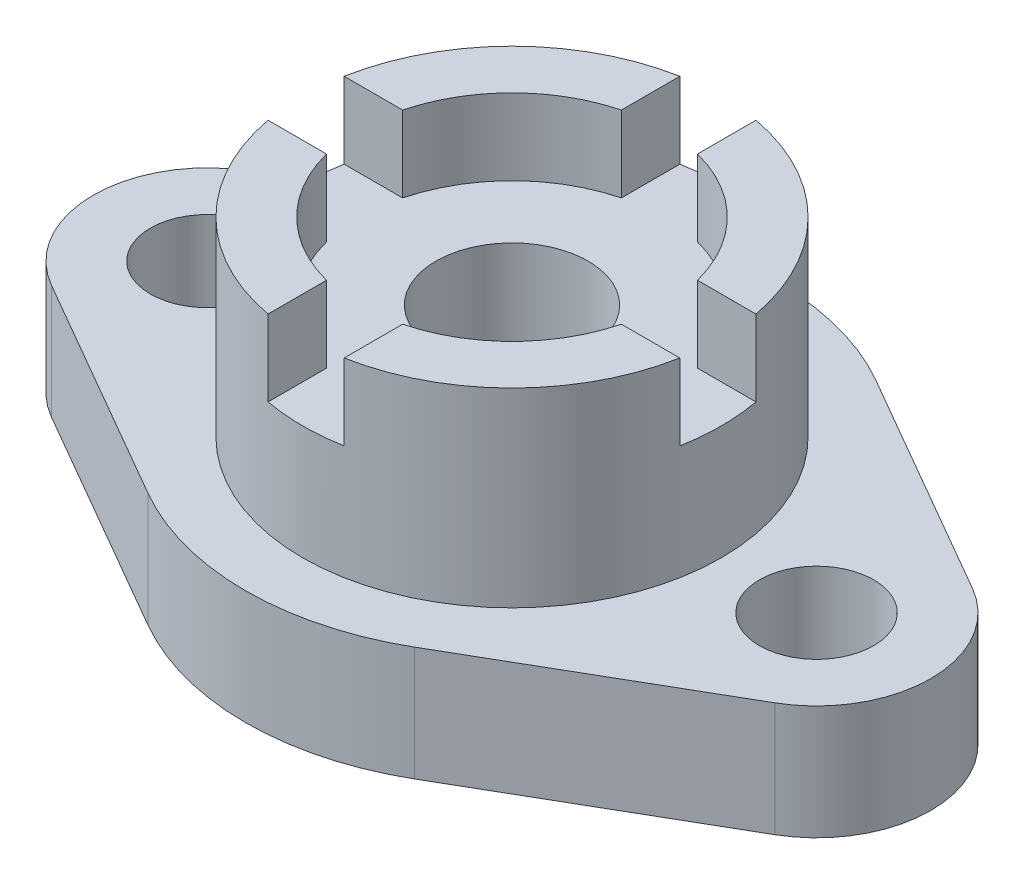
ISO-10303-21;
HEADER;
FILE_DESCRIPTION(('STEP AP214'),'2;1');
FILE_NAME('part.step','',(''),(''),'','','');
FILE_SCHEMA(('AUTOMOTIVE_DESIGN { 1 0 10303 214 1 1 1 1 }'));
ENDSEC;
DATA;
#1=APPLICATION_CONTEXT('core data for automotive mechanical design processes');
#2=APPLICATION_PROTOCOL_DEFINITION('international standard','automotive_design',2000,#1);
#3=PRODUCT_CONTEXT('',#1,'mechanical');
#4=PRODUCT('Part','Part','',(#3));
#5=PRODUCT_RELATED_PRODUCT_CATEGORY('part','',(#4));
#6=PRODUCT_DEFINITION_FORMATION('','',#4);
#7=PRODUCT_DEFINITION_CONTEXT('part definition',#1,'design');
#8=PRODUCT_DEFINITION('design','',#6,#7);
#9=PRODUCT_DEFINITION_SHAPE('','',#8);
#10=(LENGTH_UNIT() NAMED_UNIT(*) SI_UNIT(.MILLI.,.METRE.));
#11=(NAMED_UNIT(*) PLANE_ANGLE_UNIT() SI_UNIT($,.RADIAN.));
#12=(NAMED_UNIT(*) SI_UNIT($,.STERADIAN.) SOLID_ANGLE_UNIT());
#13=UNCERTAINTY_MEASURE_WITH_UNIT(LENGTH_MEASURE(1.E-05),#10,'distance_accuracy_value','');
#14=(GEOMETRIC_REPRESENTATION_CONTEXT(3) GLOBAL_UNCERTAINTY_ASSIGNED_CONTEXT((#13)) GLOBAL_UNIT_ASSIGNED_CONTEXT((#10,
#11,#12)) REPRESENTATION_CONTEXT('',''));
#15=CARTESIAN_POINT('',(0.,0.,0.));
#16=DIRECTION('',(0.,0.,1.));
#17=DIRECTION('',(1.,0.,0.));
#18=AXIS2_PLACEMENT_3D('',#15,#16,#17);
#19=CARTESIAN_POINT('',(0.,2.,0.));
#20=DIRECTION('',(0.,1.,0.));
#21=DIRECTION('',(0.,0.,1.));
#22=AXIS2_PLACEMENT_3D('',#19,#20,#21);
#23=PLANE('',#22);
#24=DIRECTION('',(0.,0.,-1.));
#25=VECTOR('',#24,1.);
#26=CARTESIAN_POINT('',(0.25,2.,-1.352081728299));
#27=LINE('',#26,#25);
#28=CARTESIAN_POINT('',(0.25,2.,-0.968245836551854));
#29=VERTEX_POINT('',#28);
#30=CARTESIAN_POINT('',(0.25,2.,-1.352081728299));
#31=VERTEX_POINT('',#30);
#32=EDGE_CURVE('E266',#29,#31,#27,.T.);
#33=ORIENTED_EDGE('',*,*,#32,.F.);
#34=CARTESIAN_POINT('',(0.,2.,0.));
#35=DIRECTION('',(0.,1.,0.));
#36=DIRECTION('',(0.,0.,1.));
#37=AXIS2_PLACEMENT_3D('',#34,#35,#36);
#38=CIRCLE('',#37,1.);
#39=CARTESIAN_POINT('',(0.968245836551854,2.,-0.25));
#40=VERTEX_POINT('',#39);
#41=EDGE_CURVE('E270',#40,#29,#38,.T.);
#42=ORIENTED_EDGE('',*,*,#41,.F.);
#43=DIRECTION('',(-1.,0.,0.));
#44=VECTOR('',#43,1.);
#45=CARTESIAN_POINT('',(0.968245836551854,2.,-0.25));
#46=LINE('',#45,#44);
#47=CARTESIAN_POINT('',(1.352081728299,2.,-0.25));
#48=VERTEX_POINT('',#47);
#49=EDGE_CURVE('E273',#48,#40,#46,.T.);
#50=ORIENTED_EDGE('',*,*,#49,.F.);
#51=CARTESIAN_POINT('',(0.,2.,0.));
#52=DIRECTION('',(0.,1.,0.));
#53=DIRECTION('',(0.,0.,1.));
#54=AXIS2_PLACEMENT_3D('',#51,#52,#53);
#55=CIRCLE('',#54,1.375);
#56=EDGE_CURVE('E216',#48,#31,#55,.T.);
#57=ORIENTED_EDGE('',*,*,#56,.T.);
#58=EDGE_LOOP('',(#33,#42,#50,#57));
#59=FACE_BOUND('',#58,.T.);
#60=ADVANCED_FACE('F37',(#59),#23,.T.);
#61=DIRECTION('',(1.,0.,0.));
#62=VECTOR('',#61,1.);
#63=CARTESIAN_POINT('',(1.352081728299,2.,0.25));
#64=LINE('',#63,#62);
#65=CARTESIAN_POINT('',(0.968245836551854,2.,0.25));
#66=VERTEX_POINT('',#65);
#67=CARTESIAN_POINT('',(1.352081728299,2.,0.25));
#68=VERTEX_POINT('',#67);
#69=EDGE_CURVE('E276',#66,#68,#64,.T.);
#70=ORIENTED_EDGE('',*,*,#69,.F.);
#71=CARTESIAN_POINT('',(0.,2.,0.));
#72=DIRECTION('',(0.,1.,0.));
#73=DIRECTION('',(0.,0.,1.));
#74=AXIS2_PLACEMENT_3D('',#71,#72,#73);
#75=CIRCLE('',#74,1.);
#76=CARTESIAN_POINT('',(0.25,2.,0.968245836551854));
#77=VERTEX_POINT('',#76);
#78=EDGE_CURVE('E279',#77,#66,#75,.T.);
#79=ORIENTED_EDGE('',*,*,#78,.F.);
#80=DIRECTION('',(0.,0.,-1.));
#81=VECTOR('',#80,1.);
#82=CARTESIAN_POINT('',(0.25,2.,1.352081728299));
#83=LINE('',#82,#81);
#84=CARTESIAN_POINT('',(0.25,2.,1.352081728299));
#85=VERTEX_POINT('',#84);
#86=EDGE_CURVE('E282',#85,#77,#83,.T.);
#87=ORIENTED_EDGE('',*,*,#86,.F.);
#88=EDGE_CURVE('E201',#85,#68,#55,.T.);
#89=ORIENTED_EDGE('',*,*,#88,.T.);
#90=EDGE_LOOP('',(#70,#79,#87,#89));
#91=FACE_BOUND('',#90,.T.);
#92=ADVANCED_FACE('F456',(#91),#23,.T.);
#93=DIRECTION('',(0.,0.,1.));
#94=VECTOR('',#93,1.);
#95=CARTESIAN_POINT('',(-0.25,2.,1.352081728299));
#96=LINE('',#95,#94);
#97=CARTESIAN_POINT('',(-0.25,2.,0.968245836551854));
#98=VERTEX_POINT('',#97);
#99=CARTESIAN_POINT('',(-0.25,2.,1.352081728299));
#100=VERTEX_POINT('',#99);
#101=EDGE_CURVE('E285',#98,#100,#96,.T.);
#102=ORIENTED_EDGE('',*,*,#101,.F.);
#103=CARTESIAN_POINT('',(0.,2.,0.));
#104=DIRECTION('',(0.,1.,0.));
#105=DIRECTION('',(0.,0.,1.));
#106=AXIS2_PLACEMENT_3D('',#103,#104,#105);
#107=CIRCLE('',#106,1.);
#108=CARTESIAN_POINT('',(-0.968245836551854,2.,0.25));
#109=VERTEX_POINT('',#108);
#110=EDGE_CURVE('E288',#109,#98,#107,.T.);
#111=ORIENTED_EDGE('',*,*,#110,.F.);
#112=DIRECTION('',(1.,0.,0.));
#113=VECTOR('',#112,1.);
#114=CARTESIAN_POINT('',(-1.352081728299,2.,0.25));
#115=LINE('',#114,#113);
#116=CARTESIAN_POINT('',(-1.352081728299,2.,0.25));
#117=VERTEX_POINT('',#116);
#118=EDGE_CURVE('E291',#117,#109,#115,.T.);
#119=ORIENTED_EDGE('',*,*,#118,.F.);
#120=EDGE_CURVE('E212',#117,#100,#55,.T.);
#121=ORIENTED_EDGE('',*,*,#120,.T.);
#122=EDGE_LOOP('',(#102,#111,#119,#121));
#123=FACE_BOUND('',#122,.T.);
#124=ADVANCED_FACE('F374',(#123),#23,.T.);
#125=CARTESIAN_POINT('',(0.,0.,0.));
#126=DIRECTION('',(0.,1.,0.));
#127=DIRECTION('',(0.,0.,1.));
#128=AXIS2_PLACEMENT_3D('',#125,#126,#127);
#129=CYLINDRICAL_SURFACE('',#128,0.5);
#130=CARTESIAN_POINT('',(0.,0.,0.));
#131=DIRECTION('',(0.,1.,0.));
#132=DIRECTION('',(0.,0.,1.));
#133=AXIS2_PLACEMENT_3D('',#130,#131,#132);
#134=CIRCLE('',#133,0.5);
#135=CARTESIAN_POINT('',(0.,0.,0.5));
#136=VERTEX_POINT('',#135);
#137=EDGE_CURVE('E213',#136,#136,#134,.T.);
#138=ORIENTED_EDGE('',*,*,#137,.F.);
#139=EDGE_LOOP('',(#138));
#140=FACE_BOUND('',#139,.T.);
#141=CARTESIAN_POINT('',(0.,1.5,0.));
#142=DIRECTION('',(0.,1.,0.));
#143=DIRECTION('',(0.,0.,1.));
#144=AXIS2_PLACEMENT_3D('',#141,#142,#143);
#145=CIRCLE('',#144,0.5);
#146=CARTESIAN_POINT('',(0.,1.5,0.5));
#147=VERTEX_POINT('',#146);
#148=EDGE_CURVE('E41',#147,#147,#145,.F.);
#149=ORIENTED_EDGE('',*,*,#148,.F.);
#150=EDGE_LOOP('',(#149));
#151=FACE_BOUND('',#150,.T.);
#152=ADVANCED_FACE('F458',(#140,#151),#129,.F.);
#153=CARTESIAN_POINT('',(-2.,0.75,0.));
#154=DIRECTION('',(0.,-1.,0.));
#155=DIRECTION('',(0.,0.,-1.));
#156=AXIS2_PLACEMENT_3D('',#153,#154,#155);
#157=CYLINDRICAL_SURFACE('',#156,0.749999999999999);
#158=CARTESIAN_POINT('',(-2.,0.,0.));
#159=DIRECTION('',(0.,1.,0.));
#160=DIRECTION('',(0.,0.,1.));
#161=AXIS2_PLACEMENT_3D('',#158,#159,#160);
#162=CIRCLE('',#161,0.749999999999999);
#163=CARTESIAN_POINT('',(-2.375,0.,-0.649519052838329));
#164=VERTEX_POINT('',#163);
#165=CARTESIAN_POINT('',(-2.37499999999998,0.,0.649519052838339));
#166=VERTEX_POINT('',#165);
#167=EDGE_CURVE('E147',#164,#166,#162,.T.);
#168=ORIENTED_EDGE('',*,*,#167,.T.);
#169=DIRECTION('',(0.,-1.,0.));
#170=VECTOR('',#169,1.);
#171=CARTESIAN_POINT('',(-2.37499999999998,0.75,0.649519052838339));
#172=LINE('',#171,#170);
#173=CARTESIAN_POINT('',(-2.37499999999998,0.75,0.649519052838339));
#174=VERTEX_POINT('',#173);
#175=EDGE_CURVE('E11',#174,#166,#172,.T.);
#176=ORIENTED_EDGE('',*,*,#175,.F.);
#177=CARTESIAN_POINT('',(-2.,0.75,0.));
#178=DIRECTION('',(0.,1.,0.));
#179=DIRECTION('',(0.,0.,1.));
#180=AXIS2_PLACEMENT_3D('',#177,#178,#179);
#181=CIRCLE('',#180,0.749999999999999);
#182=CARTESIAN_POINT('',(-2.375,0.75,-0.649519052838329));
#183=VERTEX_POINT('',#182);
#184=EDGE_CURVE('E163',#183,#174,#181,.T.);
#185=ORIENTED_EDGE('',*,*,#184,.F.);
#186=DIRECTION('',(0.,-1.,0.));
#187=VECTOR('',#186,1.);
#188=CARTESIAN_POINT('',(-2.375,0.75,-0.649519052838329));
#189=LINE('',#188,#187);
#190=EDGE_CURVE('E143',#183,#164,#189,.T.);
#191=ORIENTED_EDGE('',*,*,#190,.T.);
#192=EDGE_LOOP('',(#168,#176,#185,#191));
#193=FACE_BOUND('',#192,.T.);
#194=ADVANCED_FACE('F39',(#193),#157,.T.);
#195=CARTESIAN_POINT('',(-2.37499999999998,0.75,0.649519052838339));
#196=DIRECTION('',(0.500000000000001,0.,-0.866025403784438));
#197=DIRECTION('',(-0.866025403784438,0.,-0.500000000000001));
#198=AXIS2_PLACEMENT_3D('',#195,#196,#197);
#199=PLANE('',#198);
#200=DIRECTION('',(0.866025403784438,0.,0.500000000000001));
#201=VECTOR('',#200,1.);
#202=CARTESIAN_POINT('',(-2.37499999999998,0.,0.649519052838339));
#203=LINE('',#202,#201);
#204=CARTESIAN_POINT('',(-0.875000000000001,0.,1.51554445662277));
#205=VERTEX_POINT('',#204);
#206=EDGE_CURVE('E150',#166,#205,#203,.T.);
#207=ORIENTED_EDGE('',*,*,#206,.T.);
#208=DIRECTION('',(0.,-1.,0.));
#209=VECTOR('',#208,1.);
#210=CARTESIAN_POINT('',(-0.875000000000001,0.75,1.51554445662277));
#211=LINE('',#210,#209);
#212=CARTESIAN_POINT('',(-0.875000000000001,0.75,1.51554445662277));
#213=VERTEX_POINT('',#212);
#214=EDGE_CURVE('E46',#213,#205,#211,.T.);
#215=ORIENTED_EDGE('',*,*,#214,.F.);
#216=DIRECTION('',(0.866025403784438,0.,0.500000000000001));
#217=VECTOR('',#216,1.);
#218=CARTESIAN_POINT('',(-2.37499999999998,0.75,0.649519052838339));
#219=LINE('',#218,#217);
#220=EDGE_CURVE('E103',#174,#213,#219,.T.);
#221=ORIENTED_EDGE('',*,*,#220,.F.);
#222=ORIENTED_EDGE('',*,*,#175,.T.);
#223=EDGE_LOOP('',(#207,#215,#221,#222));
#224=FACE_BOUND('',#223,.T.);
#225=ADVANCED_FACE('F708',(#224),#199,.F.);
#226=CARTESIAN_POINT('',(0.,0.75,0.));
#227=DIRECTION('',(0.,-1.,0.));
#228=DIRECTION('',(0.,0.,-1.));
#229=AXIS2_PLACEMENT_3D('',#226,#227,#228);
#230=CYLINDRICAL_SURFACE('',#229,1.75);
#231=CARTESIAN_POINT('',(0.,0.,0.));
#232=DIRECTION('',(0.,1.,0.));
#233=DIRECTION('',(0.,0.,1.));
#234=AXIS2_PLACEMENT_3D('',#231,#232,#233);
#235=CIRCLE('',#234,1.75);
#236=CARTESIAN_POINT('',(0.875000000000001,0.,1.51554445662277));
#237=VERTEX_POINT('',#236);
#238=EDGE_CURVE('E153',#205,#237,#235,.T.);
#239=ORIENTED_EDGE('',*,*,#238,.T.);
#240=DIRECTION('',(0.,-1.,0.));
#241=VECTOR('',#240,1.);
#242=CARTESIAN_POINT('',(0.875000000000001,0.75,1.51554445662277));
#243=LINE('',#242,#241);
#244=CARTESIAN_POINT('',(0.875000000000001,0.75,1.51554445662277));
#245=VERTEX_POINT('',#244);
#246=EDGE_CURVE('E170',#245,#237,#243,.T.);
#247=ORIENTED_EDGE('',*,*,#246,.F.);
#248=CARTESIAN_POINT('',(0.,0.75,0.));
#249=DIRECTION('',(0.,1.,0.));
#250=DIRECTION('',(0.,0.,1.));
#251=AXIS2_PLACEMENT_3D('',#248,#249,#250);
#252=CIRCLE('',#251,1.75);
#253=EDGE_CURVE('E179',#213,#245,#252,.T.);
#254=ORIENTED_EDGE('',*,*,#253,.F.);
#255=ORIENTED_EDGE('',*,*,#214,.T.);
#256=EDGE_LOOP('',(#239,#247,#254,#255));
#257=FACE_BOUND('',#256,.T.);
#258=ADVANCED_FACE('F177',(#257),#230,.T.);
#259=CARTESIAN_POINT('',(2.37499999999998,0.75,0.649519052838338));
#260=DIRECTION('',(-0.5,0.,-0.866025403784439));
#261=DIRECTION('',(-0.866025403784439,0.,0.5));
#262=AXIS2_PLACEMENT_3D('',#259,#260,#261);
#263=PLANE('',#262);
#264=DIRECTION('',(0.866025403784439,0.,-0.5));
#265=VECTOR('',#264,1.);
#266=CARTESIAN_POINT('',(2.37499999999998,0.,0.649519052838338));
#267=LINE('',#266,#265);
#268=CARTESIAN_POINT('',(2.37499999999998,0.,0.649519052838338));
#269=VERTEX_POINT('',#268);
#270=EDGE_CURVE('E155',#237,#269,#267,.T.);
#271=ORIENTED_EDGE('',*,*,#270,.T.);
#272=DIRECTION('',(0.,-1.,0.));
#273=VECTOR('',#272,1.);
#274=CARTESIAN_POINT('',(2.37499999999998,0.75,0.649519052838338));
#275=LINE('',#274,#273);
#276=CARTESIAN_POINT('',(2.37499999999998,0.75,0.649519052838338));
#277=VERTEX_POINT('',#276);
#278=EDGE_CURVE('E167',#277,#269,#275,.T.);
#279=ORIENTED_EDGE('',*,*,#278,.F.);
#280=DIRECTION('',(0.866025403784439,0.,-0.5));
#281=VECTOR('',#280,1.);
#282=CARTESIAN_POINT('',(2.37499999999998,0.75,0.649519052838338));
#283=LINE('',#282,#281);
#284=EDGE_CURVE('E191',#245,#277,#283,.T.);
#285=ORIENTED_EDGE('',*,*,#284,.F.);
#286=ORIENTED_EDGE('',*,*,#246,.T.);
#287=EDGE_LOOP('',(#271,#279,#285,#286));
#288=FACE_BOUND('',#287,.T.);
#289=ADVANCED_FACE('F187',(#288),#263,.F.);
#290=CARTESIAN_POINT('',(2.,0.75,0.));
#291=DIRECTION('',(0.,-1.,0.));
#292=DIRECTION('',(0.,0.,-1.));
#293=AXIS2_PLACEMENT_3D('',#290,#291,#292);
#294=CYLINDRICAL_SURFACE('',#293,0.749999999999999);
#295=CARTESIAN_POINT('',(2.,0.,0.));
#296=DIRECTION('',(0.,1.,0.));
#297=DIRECTION('',(0.,0.,1.));
#298=AXIS2_PLACEMENT_3D('',#295,#296,#297);
#299=CIRCLE('',#298,0.749999999999999);
#300=CARTESIAN_POINT('',(2.375,0.,-0.649519052838328));
#301=VERTEX_POINT('',#300);
#302=EDGE_CURVE('E157',#269,#301,#299,.T.);
#303=ORIENTED_EDGE('',*,*,#302,.T.);
#304=DIRECTION('',(0.,-1.,0.));
#305=VECTOR('',#304,1.);
#306=CARTESIAN_POINT('',(2.375,0.75,-0.649519052838328));
#307=LINE('',#306,#305);
#308=CARTESIAN_POINT('',(2.375,0.75,-0.649519052838328));
#309=VERTEX_POINT('',#308);
#310=EDGE_CURVE('E138',#309,#301,#307,.T.);
#311=ORIENTED_EDGE('',*,*,#310,.F.);
#312=CARTESIAN_POINT('',(2.,0.75,0.));
#313=DIRECTION('',(0.,1.,0.));
#314=DIRECTION('',(0.,0.,1.));
#315=AXIS2_PLACEMENT_3D('',#312,#313,#314);
#316=CIRCLE('',#315,0.749999999999999);
#317=EDGE_CURVE('E126',#277,#309,#316,.T.);
#318=ORIENTED_EDGE('',*,*,#317,.F.);
#319=ORIENTED_EDGE('',*,*,#278,.T.);
#320=EDGE_LOOP('',(#303,#311,#318,#319));
#321=FACE_BOUND('',#320,.T.);
#322=ADVANCED_FACE('F190',(#321),#294,.T.);
#323=CARTESIAN_POINT('',(2.375,0.75,-0.64951905283833));
#324=DIRECTION('',(-0.5,0.,0.866025403784438));
#325=DIRECTION('',(0.866025403784439,0.,0.5));
#326=AXIS2_PLACEMENT_3D('',#323,#324,#325);
#327=PLANE('',#326);
#328=DIRECTION('',(-0.866025403784439,0.,-0.5));
#329=VECTOR('',#328,1.);
#330=CARTESIAN_POINT('',(2.375,0.,-0.64951905283833));
#331=LINE('',#330,#329);
#332=CARTESIAN_POINT('',(0.875,0.,-1.51554445662277));
#333=VERTEX_POINT('',#332);
#334=EDGE_CURVE('E135',#301,#333,#331,.T.);
#335=ORIENTED_EDGE('',*,*,#334,.T.);
#336=DIRECTION('',(0.,-1.,0.));
#337=VECTOR('',#336,1.);
#338=CARTESIAN_POINT('',(0.875,0.75,-1.51554445662277));
#339=LINE('',#338,#337);
#340=CARTESIAN_POINT('',(0.875,0.75,-1.51554445662277));
#341=VERTEX_POINT('',#340);
#342=EDGE_CURVE('E132',#341,#333,#339,.T.);
#343=ORIENTED_EDGE('',*,*,#342,.F.);
#344=DIRECTION('',(-0.866025403784439,0.,-0.5));
#345=VECTOR('',#344,1.);
#346=CARTESIAN_POINT('',(2.375,0.75,-0.64951905283833));
#347=LINE('',#346,#345);
#348=EDGE_CURVE('E119',#309,#341,#347,.T.);
#349=ORIENTED_EDGE('',*,*,#348,.F.);
#350=ORIENTED_EDGE('',*,*,#310,.T.);
#351=EDGE_LOOP('',(#335,#343,#349,#350));
#352=FACE_BOUND('',#351,.T.);
#353=ADVANCED_FACE('F133',(#352),#327,.F.);
#354=CARTESIAN_POINT('',(0.,0.75,0.));
#355=DIRECTION('',(0.,-1.,0.));
#356=DIRECTION('',(0.,0.,-1.));
#357=AXIS2_PLACEMENT_3D('',#354,#355,#356);
#358=CYLINDRICAL_SURFACE('',#357,1.75);
#359=CARTESIAN_POINT('',(0.,0.,0.));
#360=DIRECTION('',(0.,1.,0.));
#361=DIRECTION('',(0.,0.,1.));
#362=AXIS2_PLACEMENT_3D('',#359,#360,#361);
#363=CIRCLE('',#362,1.75);
#364=CARTESIAN_POINT('',(-0.875,0.,-1.51554445662277));
#365=VERTEX_POINT('',#364);
#366=EDGE_CURVE('E160',#333,#365,#363,.T.);
#367=ORIENTED_EDGE('',*,*,#366,.T.);
#368=DIRECTION('',(0.,-1.,0.));
#369=VECTOR('',#368,1.);
#370=CARTESIAN_POINT('',(-0.875,0.75,-1.51554445662277));
#371=LINE('',#370,#369);
#372=CARTESIAN_POINT('',(-0.875,0.75,-1.51554445662277));
#373=VERTEX_POINT('',#372);
#374=EDGE_CURVE('E139',#373,#365,#371,.T.);
#375=ORIENTED_EDGE('',*,*,#374,.F.);
#376=CARTESIAN_POINT('',(0.,0.75,0.));
#377=DIRECTION('',(0.,1.,0.));
#378=DIRECTION('',(0.,0.,1.));
#379=AXIS2_PLACEMENT_3D('',#376,#377,#378);
#380=CIRCLE('',#379,1.75);
#381=EDGE_CURVE('E123',#341,#373,#380,.T.);
#382=ORIENTED_EDGE('',*,*,#381,.F.);
#383=ORIENTED_EDGE('',*,*,#342,.T.);
#384=EDGE_LOOP('',(#367,#375,#382,#383));
#385=FACE_BOUND('',#384,.T.);
#386=ADVANCED_FACE('F141',(#385),#358,.T.);
#387=CARTESIAN_POINT('',(-2.375,0.75,-0.649519052838329));
#388=DIRECTION('',(0.5,0.,0.866025403784438));
#389=DIRECTION('',(0.866025403784439,0.,-0.5));
#390=AXIS2_PLACEMENT_3D('',#387,#388,#389);
#391=PLANE('',#390);
#392=DIRECTION('',(-0.866025403784439,0.,0.5));
#393=VECTOR('',#392,1.);
#394=CARTESIAN_POINT('',(-2.375,0.,-0.649519052838329));
#395=LINE('',#394,#393);
#396=EDGE_CURVE('E95',#365,#164,#395,.T.);
#397=ORIENTED_EDGE('',*,*,#396,.T.);
#398=ORIENTED_EDGE('',*,*,#190,.F.);
#399=DIRECTION('',(-0.866025403784439,0.,0.5));
#400=VECTOR('',#399,1.);
#401=CARTESIAN_POINT('',(-2.375,0.75,-0.649519052838329));
#402=LINE('',#401,#400);
#403=EDGE_CURVE('E62',#373,#183,#402,.T.);
#404=ORIENTED_EDGE('',*,*,#403,.F.);
#405=ORIENTED_EDGE('',*,*,#374,.T.);
#406=EDGE_LOOP('',(#397,#398,#404,#405));
#407=FACE_BOUND('',#406,.T.);
#408=ADVANCED_FACE('F644',(#407),#391,.F.);
#409=CARTESIAN_POINT('',(-2.,0.75,0.));
#410=DIRECTION('',(0.,1.,0.));
#411=DIRECTION('',(0.,0.,1.));
#412=AXIS2_PLACEMENT_3D('',#409,#410,#411);
#413=PLANE('',#412);
#414=CARTESIAN_POINT('',(0.,0.75,0.));
#415=DIRECTION('',(0.,1.,0.));
#416=DIRECTION('',(0.,0.,1.));
#417=AXIS2_PLACEMENT_3D('',#414,#415,#416);
#418=CIRCLE('',#417,1.375);
#419=CARTESIAN_POINT('',(0.,0.75,1.375));
#420=VERTEX_POINT('',#419);
#421=EDGE_CURVE('E209',#420,#420,#418,.T.);
#422=ORIENTED_EDGE('',*,*,#421,.F.);
#423=EDGE_LOOP('',(#422));
#424=FACE_BOUND('',#423,.T.);
#425=CARTESIAN_POINT('',(-2.,0.75,0.));
#426=DIRECTION('',(0.,1.,0.));
#427=DIRECTION('',(0.,0.,1.));
#428=AXIS2_PLACEMENT_3D('',#425,#426,#427);
#429=CIRCLE('',#428,0.375);
#430=CARTESIAN_POINT('',(-2.,0.75,0.375));
#431=VERTEX_POINT('',#430);
#432=EDGE_CURVE('E204',#431,#431,#429,.T.);
#433=ORIENTED_EDGE('',*,*,#432,.F.);
#434=EDGE_LOOP('',(#433));
#435=FACE_BOUND('',#434,.T.);
#436=CARTESIAN_POINT('',(2.,0.75,0.));
#437=DIRECTION('',(0.,1.,0.));
#438=DIRECTION('',(0.,0.,1.));
#439=AXIS2_PLACEMENT_3D('',#436,#437,#438);
#440=CIRCLE('',#439,0.375);
#441=CARTESIAN_POINT('',(2.,0.75,0.375000000000001));
#442=VERTEX_POINT('',#441);
#443=EDGE_CURVE('E197',#442,#442,#440,.T.);
#444=ORIENTED_EDGE('',*,*,#443,.F.);
#445=EDGE_LOOP('',(#444));
#446=FACE_BOUND('',#445,.T.);
#447=ORIENTED_EDGE('',*,*,#184,.T.);
#448=ORIENTED_EDGE('',*,*,#220,.T.);
#449=ORIENTED_EDGE('',*,*,#253,.T.);
#450=ORIENTED_EDGE('',*,*,#284,.T.);
#451=ORIENTED_EDGE('',*,*,#317,.T.);
#452=ORIENTED_EDGE('',*,*,#348,.T.);
#453=ORIENTED_EDGE('',*,*,#381,.T.);
#454=ORIENTED_EDGE('',*,*,#403,.T.);
#455=EDGE_LOOP('',(#447,#448,#449,#450,#451,#452,#453,#454));
#456=FACE_BOUND('',#455,.T.);
#457=ADVANCED_FACE('F121',(#424,#435,#446,#456),#413,.T.);
#458=CARTESIAN_POINT('',(-2.,0.,0.));
#459=DIRECTION('',(0.,1.,0.));
#460=DIRECTION('',(0.,0.,1.));
#461=AXIS2_PLACEMENT_3D('',#458,#459,#460);
#462=PLANE('',#461);
#463=ORIENTED_EDGE('',*,*,#137,.T.);
#464=EDGE_LOOP('',(#463));
#465=FACE_BOUND('',#464,.T.);
#466=CARTESIAN_POINT('',(-2.,0.,0.));
#467=DIRECTION('',(0.,1.,0.));
#468=DIRECTION('',(0.,0.,1.));
#469=AXIS2_PLACEMENT_3D('',#466,#467,#468);
#470=CIRCLE('',#469,0.375);
#471=CARTESIAN_POINT('',(-2.,0.,0.375));
#472=VERTEX_POINT('',#471);
#473=EDGE_CURVE('E151',#472,#472,#470,.T.);
#474=ORIENTED_EDGE('',*,*,#473,.T.);
#475=EDGE_LOOP('',(#474));
#476=FACE_BOUND('',#475,.T.);
#477=CARTESIAN_POINT('',(2.,0.,0.));
#478=DIRECTION('',(0.,1.,0.));
#479=DIRECTION('',(0.,0.,1.));
#480=AXIS2_PLACEMENT_3D('',#477,#478,#479);
#481=CIRCLE('',#480,0.375);
#482=CARTESIAN_POINT('',(2.,0.,0.375000000000001));
#483=VERTEX_POINT('',#482);
#484=EDGE_CURVE('E200',#483,#483,#481,.T.);
#485=ORIENTED_EDGE('',*,*,#484,.T.);
#486=EDGE_LOOP('',(#485));
#487=FACE_BOUND('',#486,.T.);
#488=ORIENTED_EDGE('',*,*,#167,.F.);
#489=ORIENTED_EDGE('',*,*,#396,.F.);
#490=ORIENTED_EDGE('',*,*,#366,.F.);
#491=ORIENTED_EDGE('',*,*,#334,.F.);
#492=ORIENTED_EDGE('',*,*,#302,.F.);
#493=ORIENTED_EDGE('',*,*,#270,.F.);
#494=ORIENTED_EDGE('',*,*,#238,.F.);
#495=ORIENTED_EDGE('',*,*,#206,.F.);
#496=EDGE_LOOP('',(#488,#489,#490,#491,#492,#493,#494,#495));
#497=FACE_BOUND('',#496,.T.);
#498=ADVANCED_FACE('F183',(#465,#476,#487,#497),#462,.F.);
#499=CARTESIAN_POINT('',(2.,0.,0.));
#500=DIRECTION('',(0.,1.,0.));
#501=DIRECTION('',(0.,0.,1.));
#502=AXIS2_PLACEMENT_3D('',#499,#500,#501);
#503=CYLINDRICAL_SURFACE('',#502,0.375);
#504=ORIENTED_EDGE('',*,*,#484,.F.);
#505=EDGE_LOOP('',(#504));
#506=FACE_BOUND('',#505,.T.);
#507=ORIENTED_EDGE('',*,*,#443,.T.);
#508=EDGE_LOOP('',(#507));
#509=FACE_BOUND('',#508,.T.);
#510=ADVANCED_FACE('F632',(#506,#509),#503,.F.);
#511=CARTESIAN_POINT('',(-2.,0.,0.));
#512=DIRECTION('',(0.,1.,0.));
#513=DIRECTION('',(0.,0.,1.));
#514=AXIS2_PLACEMENT_3D('',#511,#512,#513);
#515=CYLINDRICAL_SURFACE('',#514,0.375);
#516=ORIENTED_EDGE('',*,*,#473,.F.);
#517=EDGE_LOOP('',(#516));
#518=FACE_BOUND('',#517,.T.);
#519=ORIENTED_EDGE('',*,*,#432,.T.);
#520=EDGE_LOOP('',(#519));
#521=FACE_BOUND('',#520,.T.);
#522=ADVANCED_FACE('F452',(#518,#521),#515,.F.);
#523=CARTESIAN_POINT('',(0.,2.,0.));
#524=DIRECTION('',(0.,-1.,0.));
#525=DIRECTION('',(0.,0.,-1.));
#526=AXIS2_PLACEMENT_3D('',#523,#524,#525);
#527=CYLINDRICAL_SURFACE('',#526,1.375);
#528=ORIENTED_EDGE('',*,*,#56,.F.);
#529=DIRECTION('',(0.,1.,0.));
#530=VECTOR('',#529,1.);
#531=CARTESIAN_POINT('',(1.352081728299,1.5,-0.25));
#532=LINE('',#531,#530);
#533=CARTESIAN_POINT('',(1.352081728299,1.5,-0.25));
#534=VERTEX_POINT('',#533);
#535=EDGE_CURVE('E254',#534,#48,#532,.T.);
#536=ORIENTED_EDGE('',*,*,#535,.F.);
#537=CARTESIAN_POINT('',(0.,1.5,0.));
#538=DIRECTION('',(0.,1.,0.));
#539=DIRECTION('',(0.,0.,1.));
#540=AXIS2_PLACEMENT_3D('',#537,#538,#539);
#541=CIRCLE('',#540,1.375);
#542=CARTESIAN_POINT('',(1.352081728299,1.5,0.25));
#543=VERTEX_POINT('',#542);
#544=EDGE_CURVE('E310',#543,#534,#541,.T.);
#545=ORIENTED_EDGE('',*,*,#544,.F.);
#546=DIRECTION('',(0.,1.,0.));
#547=VECTOR('',#546,1.);
#548=CARTESIAN_POINT('',(1.352081728299,1.5,0.25));
#549=LINE('',#548,#547);
#550=EDGE_CURVE('E251',#543,#68,#549,.T.);
#551=ORIENTED_EDGE('',*,*,#550,.T.);
#552=ORIENTED_EDGE('',*,*,#88,.F.);
#553=DIRECTION('',(0.,1.,0.));
#554=VECTOR('',#553,1.);
#555=CARTESIAN_POINT('',(0.25,1.5,1.352081728299));
#556=LINE('',#555,#554);
#557=CARTESIAN_POINT('',(0.25,1.5,1.352081728299));
#558=VERTEX_POINT('',#557);
#559=EDGE_CURVE('E242',#558,#85,#556,.T.);
#560=ORIENTED_EDGE('',*,*,#559,.F.);
#561=CARTESIAN_POINT('',(0.,1.5,0.));
#562=DIRECTION('',(0.,1.,0.));
#563=DIRECTION('',(0.,0.,1.));
#564=AXIS2_PLACEMENT_3D('',#561,#562,#563);
#565=CIRCLE('',#564,1.375);
#566=CARTESIAN_POINT('',(-0.25,1.5,1.352081728299));
#567=VERTEX_POINT('',#566);
#568=EDGE_CURVE('E322',#567,#558,#565,.T.);
#569=ORIENTED_EDGE('',*,*,#568,.F.);
#570=DIRECTION('',(0.,1.,0.));
#571=VECTOR('',#570,1.);
#572=CARTESIAN_POINT('',(-0.25,1.5,1.352081728299));
#573=LINE('',#572,#571);
#574=EDGE_CURVE('E239',#567,#100,#573,.T.);
#575=ORIENTED_EDGE('',*,*,#574,.T.);
#576=ORIENTED_EDGE('',*,*,#120,.F.);
#577=DIRECTION('',(0.,1.,0.));
#578=VECTOR('',#577,1.);
#579=CARTESIAN_POINT('',(-1.352081728299,1.5,0.25));
#580=LINE('',#579,#578);
#581=CARTESIAN_POINT('',(-1.352081728299,1.5,0.25));
#582=VERTEX_POINT('',#581);
#583=EDGE_CURVE('E230',#582,#117,#580,.T.);
#584=ORIENTED_EDGE('',*,*,#583,.F.);
#585=CARTESIAN_POINT('',(0.,1.5,0.));
#586=DIRECTION('',(0.,1.,0.));
#587=DIRECTION('',(0.,0.,1.));
#588=AXIS2_PLACEMENT_3D('',#585,#586,#587);
#589=CIRCLE('',#588,1.375);
#590=CARTESIAN_POINT('',(-1.352081728299,1.5,-0.25));
#591=VERTEX_POINT('',#590);
#592=EDGE_CURVE('E334',#591,#582,#589,.T.);
#593=ORIENTED_EDGE('',*,*,#592,.F.);
#594=DIRECTION('',(0.,1.,0.));
#595=VECTOR('',#594,1.);
#596=CARTESIAN_POINT('',(-1.352081728299,1.5,-0.25));
#597=LINE('',#596,#595);
#598=CARTESIAN_POINT('',(-1.352081728299,2.,-0.25));
#599=VERTEX_POINT('',#598);
#600=EDGE_CURVE('E227',#591,#599,#597,.T.);
#601=ORIENTED_EDGE('',*,*,#600,.T.);
#602=CARTESIAN_POINT('',(-0.25,2.,-1.352081728299));
#603=VERTEX_POINT('',#602);
#604=EDGE_CURVE('E361',#603,#599,#55,.T.);
#605=ORIENTED_EDGE('',*,*,#604,.F.);
#606=DIRECTION('',(0.,1.,0.));
#607=VECTOR('',#606,1.);
#608=CARTESIAN_POINT('',(-0.25,1.5,-1.352081728299));
#609=LINE('',#608,#607);
#610=CARTESIAN_POINT('',(-0.25,1.5,-1.352081728299));
#611=VERTEX_POINT('',#610);
#612=EDGE_CURVE('E53',#611,#603,#609,.T.);
#613=ORIENTED_EDGE('',*,*,#612,.F.);
#614=CARTESIAN_POINT('',(0.,1.5,0.));
#615=DIRECTION('',(0.,1.,0.));
#616=DIRECTION('',(0.,0.,1.));
#617=AXIS2_PLACEMENT_3D('',#614,#615,#616);
#618=CIRCLE('',#617,1.375);
#619=CARTESIAN_POINT('',(0.25,1.5,-1.352081728299));
#620=VERTEX_POINT('',#619);
#621=EDGE_CURVE('E269',#620,#611,#618,.T.);
#622=ORIENTED_EDGE('',*,*,#621,.F.);
#623=DIRECTION('',(0.,1.,0.));
#624=VECTOR('',#623,1.);
#625=CARTESIAN_POINT('',(0.25,1.5,-1.352081728299));
#626=LINE('',#625,#624);
#627=EDGE_CURVE('E263',#620,#31,#626,.T.);
#628=ORIENTED_EDGE('',*,*,#627,.T.);
#629=EDGE_LOOP('',(#528,#536,#545,#551,#552,#560,#569,#575,#576,#584,#593,#601,#605,#613,#622,#628));
#630=FACE_BOUND('',#629,.T.);
#631=ORIENTED_EDGE('',*,*,#421,.T.);
#632=EDGE_LOOP('',(#631));
#633=FACE_BOUND('',#632,.T.);
#634=ADVANCED_FACE('F358',(#630,#633),#527,.T.);
#635=DIRECTION('',(-1.,0.,0.));
#636=VECTOR('',#635,1.);
#637=CARTESIAN_POINT('',(-0.968245836551854,2.,-0.25));
#638=LINE('',#637,#636);
#639=CARTESIAN_POINT('',(-0.968245836551854,2.,-0.25));
#640=VERTEX_POINT('',#639);
#641=EDGE_CURVE('E294',#640,#599,#638,.T.);
#642=ORIENTED_EDGE('',*,*,#641,.F.);
#643=CARTESIAN_POINT('',(0.,2.,0.));
#644=DIRECTION('',(0.,1.,0.));
#645=DIRECTION('',(0.,0.,1.));
#646=AXIS2_PLACEMENT_3D('',#643,#644,#645);
#647=CIRCLE('',#646,1.);
#648=CARTESIAN_POINT('',(-0.25,2.,-0.968245836551854));
#649=VERTEX_POINT('',#648);
#650=EDGE_CURVE('E297',#649,#640,#647,.T.);
#651=ORIENTED_EDGE('',*,*,#650,.F.);
#652=DIRECTION('',(0.,0.,1.));
#653=VECTOR('',#652,1.);
#654=CARTESIAN_POINT('',(-0.25,2.,-1.352081728299));
#655=LINE('',#654,#653);
#656=EDGE_CURVE('E300',#603,#649,#655,.T.);
#657=ORIENTED_EDGE('',*,*,#656,.F.);
#658=ORIENTED_EDGE('',*,*,#604,.T.);
#659=EDGE_LOOP('',(#642,#651,#657,#658));
#660=FACE_BOUND('',#659,.T.);
#661=ADVANCED_FACE('F444',(#660),#23,.T.);
#662=CARTESIAN_POINT('',(0.,1.5,0.));
#663=DIRECTION('',(0.,1.,0.));
#664=DIRECTION('',(0.,0.,1.));
#665=AXIS2_PLACEMENT_3D('',#662,#663,#664);
#666=PLANE('',#665);
#667=ORIENTED_EDGE('',*,*,#621,.T.);
#668=DIRECTION('',(0.,0.,1.));
#669=VECTOR('',#668,1.);
#670=CARTESIAN_POINT('',(-0.25,1.5,-1.352081728299));
#671=LINE('',#670,#669);
#672=CARTESIAN_POINT('',(-0.25,1.5,-0.968245836551854));
#673=VERTEX_POINT('',#672);
#674=EDGE_CURVE('E343',#611,#673,#671,.T.);
#675=ORIENTED_EDGE('',*,*,#674,.T.);
#676=CARTESIAN_POINT('',(0.,1.5,0.));
#677=DIRECTION('',(0.,1.,0.));
#678=DIRECTION('',(0.,0.,1.));
#679=AXIS2_PLACEMENT_3D('',#676,#677,#678);
#680=CIRCLE('',#679,1.);
#681=CARTESIAN_POINT('',(-0.968245836551854,1.5,-0.25));
#682=VERTEX_POINT('',#681);
#683=EDGE_CURVE('E340',#673,#682,#680,.T.);
#684=ORIENTED_EDGE('',*,*,#683,.T.);
#685=DIRECTION('',(-1.,0.,0.));
#686=VECTOR('',#685,1.);
#687=CARTESIAN_POINT('',(-0.968245836551854,1.5,-0.25));
#688=LINE('',#687,#686);
#689=EDGE_CURVE('E337',#682,#591,#688,.T.);
#690=ORIENTED_EDGE('',*,*,#689,.T.);
#691=ORIENTED_EDGE('',*,*,#592,.T.);
#692=DIRECTION('',(1.,0.,0.));
#693=VECTOR('',#692,1.);
#694=CARTESIAN_POINT('',(-1.352081728299,1.5,0.25));
#695=LINE('',#694,#693);
#696=CARTESIAN_POINT('',(-0.968245836551854,1.5,0.25));
#697=VERTEX_POINT('',#696);
#698=EDGE_CURVE('E331',#582,#697,#695,.T.);
#699=ORIENTED_EDGE('',*,*,#698,.T.);
#700=CARTESIAN_POINT('',(0.,1.5,0.));
#701=DIRECTION('',(0.,1.,0.));
#702=DIRECTION('',(0.,0.,1.));
#703=AXIS2_PLACEMENT_3D('',#700,#701,#702);
#704=CIRCLE('',#703,1.);
#705=CARTESIAN_POINT('',(-0.25,1.5,0.968245836551854));
#706=VERTEX_POINT('',#705);
#707=EDGE_CURVE('E328',#697,#706,#704,.T.);
#708=ORIENTED_EDGE('',*,*,#707,.T.);
#709=DIRECTION('',(0.,0.,1.));
#710=VECTOR('',#709,1.);
#711=CARTESIAN_POINT('',(-0.25,1.5,1.352081728299));
#712=LINE('',#711,#710);
#713=EDGE_CURVE('E325',#706,#567,#712,.T.);
#714=ORIENTED_EDGE('',*,*,#713,.T.);
#715=ORIENTED_EDGE('',*,*,#568,.T.);
#716=DIRECTION('',(0.,0.,-1.));
#717=VECTOR('',#716,1.);
#718=CARTESIAN_POINT('',(0.25,1.5,1.352081728299));
#719=LINE('',#718,#717);
#720=CARTESIAN_POINT('',(0.25,1.5,0.968245836551854));
#721=VERTEX_POINT('',#720);
#722=EDGE_CURVE('E319',#558,#721,#719,.T.);
#723=ORIENTED_EDGE('',*,*,#722,.T.);
#724=CARTESIAN_POINT('',(0.,1.5,0.));
#725=DIRECTION('',(0.,1.,0.));
#726=DIRECTION('',(0.,0.,1.));
#727=AXIS2_PLACEMENT_3D('',#724,#725,#726);
#728=CIRCLE('',#727,1.);
#729=CARTESIAN_POINT('',(0.968245836551854,1.5,0.25));
#730=VERTEX_POINT('',#729);
#731=EDGE_CURVE('E316',#721,#730,#728,.T.);
#732=ORIENTED_EDGE('',*,*,#731,.T.);
#733=DIRECTION('',(1.,0.,0.));
#734=VECTOR('',#733,1.);
#735=CARTESIAN_POINT('',(1.352081728299,1.5,0.25));
#736=LINE('',#735,#734);
#737=EDGE_CURVE('E313',#730,#543,#736,.T.);
#738=ORIENTED_EDGE('',*,*,#737,.T.);
#739=ORIENTED_EDGE('',*,*,#544,.T.);
#740=DIRECTION('',(-1.,0.,0.));
#741=VECTOR('',#740,1.);
#742=CARTESIAN_POINT('',(0.968245836551854,1.5,-0.25));
#743=LINE('',#742,#741);
#744=CARTESIAN_POINT('',(0.968245836551854,1.5,-0.25));
#745=VERTEX_POINT('',#744);
#746=EDGE_CURVE('E307',#534,#745,#743,.T.);
#747=ORIENTED_EDGE('',*,*,#746,.T.);
#748=CARTESIAN_POINT('',(0.,1.5,0.));
#749=DIRECTION('',(0.,1.,0.));
#750=DIRECTION('',(0.,0.,1.));
#751=AXIS2_PLACEMENT_3D('',#748,#749,#750);
#752=CIRCLE('',#751,1.);
#753=CARTESIAN_POINT('',(0.25,1.5,-0.968245836551854));
#754=VERTEX_POINT('',#753);
#755=EDGE_CURVE('E304',#745,#754,#752,.T.);
#756=ORIENTED_EDGE('',*,*,#755,.T.);
#757=DIRECTION('',(0.,0.,-1.));
#758=VECTOR('',#757,1.);
#759=CARTESIAN_POINT('',(0.25,1.5,-1.352081728299));
#760=LINE('',#759,#758);
#761=EDGE_CURVE('E221',#754,#620,#760,.T.);
#762=ORIENTED_EDGE('',*,*,#761,.T.);
#763=EDGE_LOOP('',(#667,#675,#684,#690,#691,#699,#708,#714,#715,#723,#732,#738,#739,#747,#756,#762));
#764=FACE_BOUND('',#763,.T.);
#765=ORIENTED_EDGE('',*,*,#148,.T.);
#766=EDGE_LOOP('',(#765));
#767=FACE_BOUND('',#766,.T.);
#768=ADVANCED_FACE('F350',(#764,#767),#666,.T.);
#769=CARTESIAN_POINT('',(0.25,1.5,-1.352081728299));
#770=DIRECTION('',(1.,0.,0.));
#771=DIRECTION('',(0.,0.,-1.));
#772=AXIS2_PLACEMENT_3D('',#769,#770,#771);
#773=PLANE('',#772);
#774=ORIENTED_EDGE('',*,*,#32,.T.);
#775=ORIENTED_EDGE('',*,*,#627,.F.);
#776=ORIENTED_EDGE('',*,*,#761,.F.);
#777=DIRECTION('',(0.,1.,0.));
#778=VECTOR('',#777,1.);
#779=CARTESIAN_POINT('',(0.25,1.5,-0.968245836551854));
#780=LINE('',#779,#778);
#781=EDGE_CURVE('E260',#754,#29,#780,.T.);
#782=ORIENTED_EDGE('',*,*,#781,.T.);
#783=EDGE_LOOP('',(#774,#775,#776,#782));
#784=FACE_BOUND('',#783,.T.);
#785=ADVANCED_FACE('F409',(#784),#773,.F.);
#786=CARTESIAN_POINT('',(0.,1.5,0.));
#787=DIRECTION('',(0.,1.,0.));
#788=DIRECTION('',(0.,0.,1.));
#789=AXIS2_PLACEMENT_3D('',#786,#787,#788);
#790=CYLINDRICAL_SURFACE('',#789,1.);
#791=ORIENTED_EDGE('',*,*,#41,.T.);
#792=ORIENTED_EDGE('',*,*,#781,.F.);
#793=ORIENTED_EDGE('',*,*,#755,.F.);
#794=DIRECTION('',(0.,1.,0.));
#795=VECTOR('',#794,1.);
#796=CARTESIAN_POINT('',(0.968245836551854,1.5,-0.25));
#797=LINE('',#796,#795);
#798=EDGE_CURVE('E257',#745,#40,#797,.T.);
#799=ORIENTED_EDGE('',*,*,#798,.T.);
#800=EDGE_LOOP('',(#791,#792,#793,#799));
#801=FACE_BOUND('',#800,.T.);
#802=ADVANCED_FACE('F502',(#801),#790,.F.);
#803=CARTESIAN_POINT('',(0.968245836551854,1.5,-0.25));
#804=DIRECTION('',(0.,0.,-1.));
#805=DIRECTION('',(-1.,0.,0.));
#806=AXIS2_PLACEMENT_3D('',#803,#804,#805);
#807=PLANE('',#806);
#808=ORIENTED_EDGE('',*,*,#49,.T.);
#809=ORIENTED_EDGE('',*,*,#798,.F.);
#810=ORIENTED_EDGE('',*,*,#746,.F.);
#811=ORIENTED_EDGE('',*,*,#535,.T.);
#812=EDGE_LOOP('',(#808,#809,#810,#811));
#813=FACE_BOUND('',#812,.T.);
#814=ADVANCED_FACE('F416',(#813),#807,.F.);
#815=CARTESIAN_POINT('',(1.352081728299,1.5,0.25));
#816=DIRECTION('',(0.,0.,1.));
#817=DIRECTION('',(1.,0.,0.));
#818=AXIS2_PLACEMENT_3D('',#815,#816,#817);
#819=PLANE('',#818);
#820=ORIENTED_EDGE('',*,*,#69,.T.);
#821=ORIENTED_EDGE('',*,*,#550,.F.);
#822=ORIENTED_EDGE('',*,*,#737,.F.);
#823=DIRECTION('',(0.,1.,0.));
#824=VECTOR('',#823,1.);
#825=CARTESIAN_POINT('',(0.968245836551854,1.5,0.25));
#826=LINE('',#825,#824);
#827=EDGE_CURVE('E248',#730,#66,#826,.T.);
#828=ORIENTED_EDGE('',*,*,#827,.T.);
#829=EDGE_LOOP('',(#820,#821,#822,#828));
#830=FACE_BOUND('',#829,.T.);
#831=ADVANCED_FACE('F472',(#830),#819,.F.);
#832=CARTESIAN_POINT('',(0.,1.5,0.));
#833=DIRECTION('',(0.,1.,0.));
#834=DIRECTION('',(0.,0.,1.));
#835=AXIS2_PLACEMENT_3D('',#832,#833,#834);
#836=CYLINDRICAL_SURFACE('',#835,1.);
#837=ORIENTED_EDGE('',*,*,#78,.T.);
#838=ORIENTED_EDGE('',*,*,#827,.F.);
#839=ORIENTED_EDGE('',*,*,#731,.F.);
#840=DIRECTION('',(0.,1.,0.));
#841=VECTOR('',#840,1.);
#842=CARTESIAN_POINT('',(0.25,1.5,0.968245836551854));
#843=LINE('',#842,#841);
#844=EDGE_CURVE('E245',#721,#77,#843,.T.);
#845=ORIENTED_EDGE('',*,*,#844,.T.);
#846=EDGE_LOOP('',(#837,#838,#839,#845));
#847=FACE_BOUND('',#846,.T.);
#848=ADVANCED_FACE('F500',(#847),#836,.F.);
#849=CARTESIAN_POINT('',(0.25,1.5,1.352081728299));
#850=DIRECTION('',(1.,0.,0.));
#851=DIRECTION('',(0.,0.,-1.));
#852=AXIS2_PLACEMENT_3D('',#849,#850,#851);
#853=PLANE('',#852);
#854=ORIENTED_EDGE('',*,*,#86,.T.);
#855=ORIENTED_EDGE('',*,*,#844,.F.);
#856=ORIENTED_EDGE('',*,*,#722,.F.);
#857=ORIENTED_EDGE('',*,*,#559,.T.);
#858=EDGE_LOOP('',(#854,#855,#856,#857));
#859=FACE_BOUND('',#858,.T.);
#860=ADVANCED_FACE('F482',(#859),#853,.F.);
#861=CARTESIAN_POINT('',(-0.25,1.5,1.352081728299));
#862=DIRECTION('',(-1.,0.,0.));
#863=DIRECTION('',(0.,0.,1.));
#864=AXIS2_PLACEMENT_3D('',#861,#862,#863);
#865=PLANE('',#864);
#866=ORIENTED_EDGE('',*,*,#101,.T.);
#867=ORIENTED_EDGE('',*,*,#574,.F.);
#868=ORIENTED_EDGE('',*,*,#713,.F.);
#869=DIRECTION('',(0.,1.,0.));
#870=VECTOR('',#869,1.);
#871=CARTESIAN_POINT('',(-0.25,1.5,0.968245836551854));
#872=LINE('',#871,#870);
#873=EDGE_CURVE('E236',#706,#98,#872,.T.);
#874=ORIENTED_EDGE('',*,*,#873,.T.);
#875=EDGE_LOOP('',(#866,#867,#868,#874));
#876=FACE_BOUND('',#875,.T.);
#877=ADVANCED_FACE('F490',(#876),#865,.F.);
#878=CARTESIAN_POINT('',(0.,1.5,0.));
#879=DIRECTION('',(0.,1.,0.));
#880=DIRECTION('',(0.,0.,1.));
#881=AXIS2_PLACEMENT_3D('',#878,#879,#880);
#882=CYLINDRICAL_SURFACE('',#881,1.);
#883=ORIENTED_EDGE('',*,*,#110,.T.);
#884=ORIENTED_EDGE('',*,*,#873,.F.);
#885=ORIENTED_EDGE('',*,*,#707,.F.);
#886=DIRECTION('',(0.,1.,0.));
#887=VECTOR('',#886,1.);
#888=CARTESIAN_POINT('',(-0.968245836551854,1.5,0.25));
#889=LINE('',#888,#887);
#890=EDGE_CURVE('E233',#697,#109,#889,.T.);
#891=ORIENTED_EDGE('',*,*,#890,.T.);
#892=EDGE_LOOP('',(#883,#884,#885,#891));
#893=FACE_BOUND('',#892,.T.);
#894=ADVANCED_FACE('F520',(#893),#882,.F.);
#895=CARTESIAN_POINT('',(-1.352081728299,1.5,0.25));
#896=DIRECTION('',(0.,0.,1.));
#897=DIRECTION('',(1.,0.,0.));
#898=AXIS2_PLACEMENT_3D('',#895,#896,#897);
#899=PLANE('',#898);
#900=ORIENTED_EDGE('',*,*,#118,.T.);
#901=ORIENTED_EDGE('',*,*,#890,.F.);
#902=ORIENTED_EDGE('',*,*,#698,.F.);
#903=ORIENTED_EDGE('',*,*,#583,.T.);
#904=EDGE_LOOP('',(#900,#901,#902,#903));
#905=FACE_BOUND('',#904,.T.);
#906=ADVANCED_FACE('F523',(#905),#899,.F.);
#907=CARTESIAN_POINT('',(-0.968245836551854,1.5,-0.25));
#908=DIRECTION('',(0.,0.,-1.));
#909=DIRECTION('',(-1.,0.,0.));
#910=AXIS2_PLACEMENT_3D('',#907,#908,#909);
#911=PLANE('',#910);
#912=ORIENTED_EDGE('',*,*,#641,.T.);
#913=ORIENTED_EDGE('',*,*,#600,.F.);
#914=ORIENTED_EDGE('',*,*,#689,.F.);
#915=DIRECTION('',(0.,1.,0.));
#916=VECTOR('',#915,1.);
#917=CARTESIAN_POINT('',(-0.968245836551854,1.5,-0.25));
#918=LINE('',#917,#916);
#919=EDGE_CURVE('E224',#682,#640,#918,.T.);
#920=ORIENTED_EDGE('',*,*,#919,.T.);
#921=EDGE_LOOP('',(#912,#913,#914,#920));
#922=FACE_BOUND('',#921,.T.);
#923=ADVANCED_FACE('F437',(#922),#911,.F.);
#924=CARTESIAN_POINT('',(0.,1.5,0.));
#925=DIRECTION('',(0.,1.,0.));
#926=DIRECTION('',(0.,0.,1.));
#927=AXIS2_PLACEMENT_3D('',#924,#925,#926);
#928=CYLINDRICAL_SURFACE('',#927,1.);
#929=ORIENTED_EDGE('',*,*,#650,.T.);
#930=ORIENTED_EDGE('',*,*,#919,.F.);
#931=ORIENTED_EDGE('',*,*,#683,.F.);
#932=DIRECTION('',(0.,1.,0.));
#933=VECTOR('',#932,1.);
#934=CARTESIAN_POINT('',(-0.25,1.5,-0.968245836551854));
#935=LINE('',#934,#933);
#936=EDGE_CURVE('E220',#673,#649,#935,.T.);
#937=ORIENTED_EDGE('',*,*,#936,.T.);
#938=EDGE_LOOP('',(#929,#930,#931,#937));
#939=FACE_BOUND('',#938,.T.);
#940=ADVANCED_FACE('F442',(#939),#928,.F.);
#941=CARTESIAN_POINT('',(-0.25,1.5,-1.352081728299));
#942=DIRECTION('',(-1.,0.,0.));
#943=DIRECTION('',(0.,0.,1.));
#944=AXIS2_PLACEMENT_3D('',#941,#942,#943);
#945=PLANE('',#944);
#946=ORIENTED_EDGE('',*,*,#656,.T.);
#947=ORIENTED_EDGE('',*,*,#936,.F.);
#948=ORIENTED_EDGE('',*,*,#674,.F.);
#949=ORIENTED_EDGE('',*,*,#612,.T.);
#950=EDGE_LOOP('',(#946,#947,#948,#949));
#951=FACE_BOUND('',#950,.T.);
#952=ADVANCED_FACE('F530',(#951),#945,.F.);
#953=CLOSED_SHELL('',(#60,#92,#124,#152,#194,#225,#258,#289,#322,#353,#386,#408,#457,#498,#510,
#522,#634,#661,#768,#785,#802,#814,#831,#848,#860,#877,#894,#906,#923,#940,#952));
#954=MANIFOLD_SOLID_BREP('B2',#953);
#955=ADVANCED_BREP_SHAPE_REPRESENTATION('',(#18,#954),#14);
#956=SHAPE_DEFINITION_REPRESENTATION(#9,#955);
ENDSEC;
END-ISO-10303-21;
